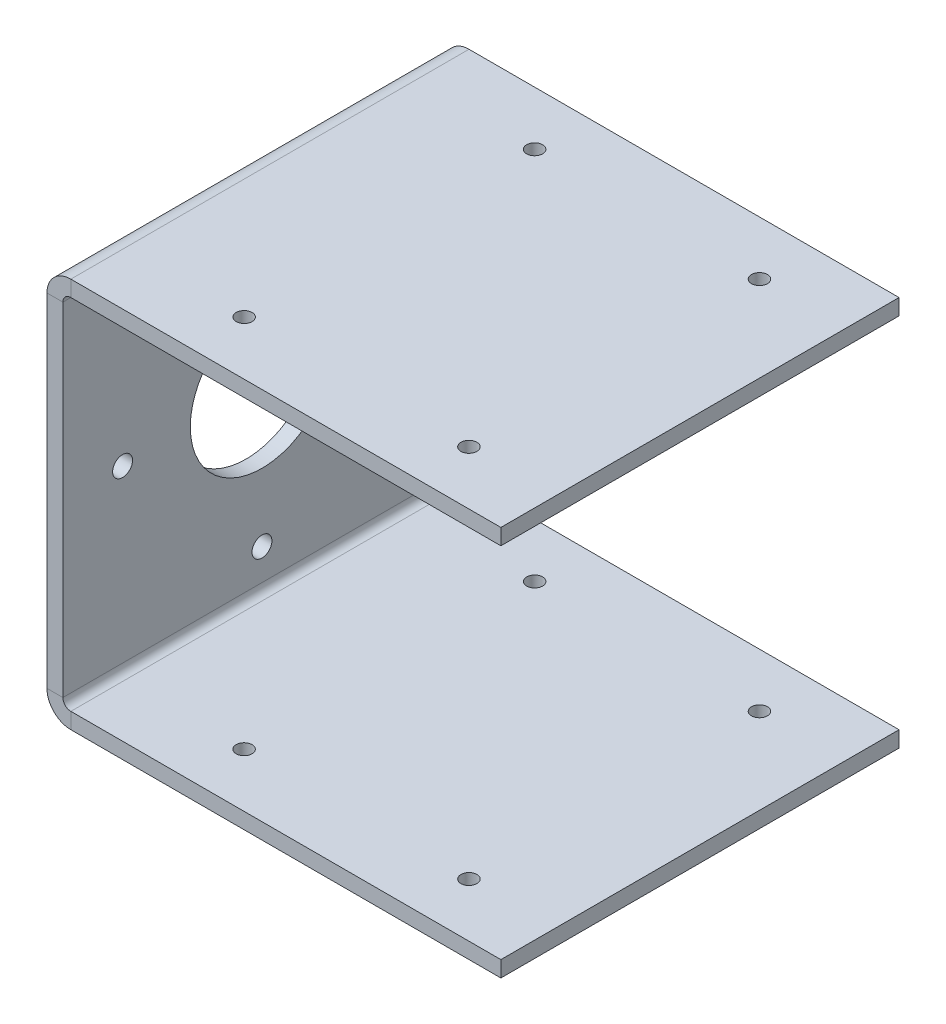
ISO-10303-21;
HEADER;
FILE_DESCRIPTION(('STEP AP214'),'2;1');
FILE_NAME('part.step','',(''),(''),'','','');
FILE_SCHEMA(('AUTOMOTIVE_DESIGN { 1 0 10303 214 1 1 1 1 }'));
ENDSEC;
DATA;
#1=APPLICATION_CONTEXT('core data for automotive mechanical design processes');
#2=APPLICATION_PROTOCOL_DEFINITION('international standard','automotive_design',2000,#1);
#3=PRODUCT_CONTEXT('',#1,'mechanical');
#4=PRODUCT('Part','Part','',(#3));
#5=PRODUCT_RELATED_PRODUCT_CATEGORY('part','',(#4));
#6=PRODUCT_DEFINITION_FORMATION('','',#4);
#7=PRODUCT_DEFINITION_CONTEXT('part definition',#1,'design');
#8=PRODUCT_DEFINITION('design','',#6,#7);
#9=PRODUCT_DEFINITION_SHAPE('','',#8);
#10=(LENGTH_UNIT() NAMED_UNIT(*) SI_UNIT(.MILLI.,.METRE.));
#11=(NAMED_UNIT(*) PLANE_ANGLE_UNIT() SI_UNIT($,.RADIAN.));
#12=(NAMED_UNIT(*) SI_UNIT($,.STERADIAN.) SOLID_ANGLE_UNIT());
#13=UNCERTAINTY_MEASURE_WITH_UNIT(LENGTH_MEASURE(1.E-05),#10,'distance_accuracy_value','');
#14=(GEOMETRIC_REPRESENTATION_CONTEXT(3) GLOBAL_UNCERTAINTY_ASSIGNED_CONTEXT((#13)) GLOBAL_UNIT_ASSIGNED_CONTEXT((#10,
#11,#12)) REPRESENTATION_CONTEXT('',''));
#15=CARTESIAN_POINT('',(0.,0.,0.));
#16=DIRECTION('',(0.,0.,1.));
#17=DIRECTION('',(1.,0.,0.));
#18=AXIS2_PLACEMENT_3D('',#15,#16,#17);
#19=CARTESIAN_POINT('',(0.,-1.99999999999996,100.));
#20=DIRECTION('',(0.,0.,1.));
#21=DIRECTION('',(1.,0.,0.));
#22=AXIS2_PLACEMENT_3D('',#19,#20,#21);
#23=PLANE('',#22);
#24=DIRECTION('',(-1.,0.,0.));
#25=VECTOR('',#24,1.);
#26=CARTESIAN_POINT('',(0.,-1.99999999999996,100.));
#27=LINE('',#26,#25);
#28=CARTESIAN_POINT('',(0.,-1.99999999999996,100.));
#29=VERTEX_POINT('',#28);
#30=CARTESIAN_POINT('',(-4.,-1.99999999999997,100.));
#31=VERTEX_POINT('',#30);
#32=EDGE_CURVE('E13',#29,#31,#27,.T.);
#33=ORIENTED_EDGE('',*,*,#32,.F.);
#34=CARTESIAN_POINT('',(2.,-1.99999999999996,100.));
#35=DIRECTION('',(0.,0.,-1.));
#36=DIRECTION('',(-1.,0.,0.));
#37=AXIS2_PLACEMENT_3D('',#34,#35,#36);
#38=CIRCLE('',#37,2.);
#39=CARTESIAN_POINT('',(2.,0.,100.));
#40=VERTEX_POINT('',#39);
#41=EDGE_CURVE('E261',#40,#29,#38,.F.);
#42=ORIENTED_EDGE('',*,*,#41,.F.);
#43=DIRECTION('',(0.,-1.,0.));
#44=VECTOR('',#43,1.);
#45=CARTESIAN_POINT('',(2.,4.00000000000006,100.));
#46=LINE('',#45,#44);
#47=CARTESIAN_POINT('',(2.,4.00000000000006,100.));
#48=VERTEX_POINT('',#47);
#49=EDGE_CURVE('E58',#48,#40,#46,.T.);
#50=ORIENTED_EDGE('',*,*,#49,.F.);
#51=CARTESIAN_POINT('',(2.,-1.99999999999996,100.));
#52=DIRECTION('',(0.,0.,1.));
#53=DIRECTION('',(1.,0.,0.));
#54=AXIS2_PLACEMENT_3D('',#51,#52,#53);
#55=CIRCLE('',#54,6.);
#56=EDGE_CURVE('E159',#48,#31,#55,.T.);
#57=ORIENTED_EDGE('',*,*,#56,.T.);
#58=EDGE_LOOP('',(#33,#42,#50,#57));
#59=FACE_BOUND('',#58,.T.);
#60=ADVANCED_FACE('F50',(#59),#23,.T.);
#61=CARTESIAN_POINT('',(2.,4.00000000000006,100.));
#62=DIRECTION('',(0.,0.,1.));
#63=DIRECTION('',(1.,0.,0.));
#64=AXIS2_PLACEMENT_3D('',#61,#62,#63);
#65=PLANE('',#64);
#66=DIRECTION('',(0.,-1.,0.));
#67=VECTOR('',#66,1.);
#68=CARTESIAN_POINT('',(0.,0.,100.));
#69=LINE('',#68,#67);
#70=CARTESIAN_POINT('',(0.,-88.,100.));
#71=VERTEX_POINT('',#70);
#72=EDGE_CURVE('E153',#29,#71,#69,.T.);
#73=ORIENTED_EDGE('',*,*,#72,.F.);
#74=ORIENTED_EDGE('',*,*,#32,.T.);
#75=DIRECTION('',(0.,-1.,0.));
#76=VECTOR('',#75,1.);
#77=CARTESIAN_POINT('',(-4.,0.,100.));
#78=LINE('',#77,#76);
#79=CARTESIAN_POINT('',(-4.,-87.9999999999999,100.));
#80=VERTEX_POINT('',#79);
#81=EDGE_CURVE('E150',#31,#80,#78,.T.);
#82=ORIENTED_EDGE('',*,*,#81,.T.);
#83=DIRECTION('',(1.,0.,0.));
#84=VECTOR('',#83,1.);
#85=CARTESIAN_POINT('',(-4.,-87.9999999999999,100.));
#86=LINE('',#85,#84);
#87=EDGE_CURVE('E242',#80,#71,#86,.T.);
#88=ORIENTED_EDGE('',*,*,#87,.T.);
#89=EDGE_LOOP('',(#73,#74,#82,#88));
#90=FACE_BOUND('',#89,.T.);
#91=ADVANCED_FACE('F148',(#90),#65,.T.);
#92=CARTESIAN_POINT('',(2.,0.,0.));
#93=DIRECTION('',(0.,0.,-1.));
#94=DIRECTION('',(-1.,0.,0.));
#95=AXIS2_PLACEMENT_3D('',#92,#93,#94);
#96=PLANE('',#95);
#97=DIRECTION('',(0.,1.,0.));
#98=VECTOR('',#97,1.);
#99=CARTESIAN_POINT('',(2.,0.,0.));
#100=LINE('',#99,#98);
#101=CARTESIAN_POINT('',(2.,0.,0.));
#102=VERTEX_POINT('',#101);
#103=CARTESIAN_POINT('',(2.,4.00000000000003,0.));
#104=VERTEX_POINT('',#103);
#105=EDGE_CURVE('E247',#102,#104,#100,.T.);
#106=ORIENTED_EDGE('',*,*,#105,.F.);
#107=CARTESIAN_POINT('',(2.,-2.,0.));
#108=DIRECTION('',(0.,0.,-1.));
#109=DIRECTION('',(-1.,0.,0.));
#110=AXIS2_PLACEMENT_3D('',#107,#108,#109);
#111=CIRCLE('',#110,2.);
#112=CARTESIAN_POINT('',(0.,-2.,0.));
#113=VERTEX_POINT('',#112);
#114=EDGE_CURVE('E199',#102,#113,#111,.F.);
#115=ORIENTED_EDGE('',*,*,#114,.T.);
#116=DIRECTION('',(1.,0.,0.));
#117=VECTOR('',#116,1.);
#118=CARTESIAN_POINT('',(-4.,-2.00000000000002,0.));
#119=LINE('',#118,#117);
#120=CARTESIAN_POINT('',(-4.,-2.00000000000002,0.));
#121=VERTEX_POINT('',#120);
#122=EDGE_CURVE('E245',#121,#113,#119,.T.);
#123=ORIENTED_EDGE('',*,*,#122,.F.);
#124=CARTESIAN_POINT('',(2.,-2.,0.));
#125=DIRECTION('',(0.,0.,1.));
#126=DIRECTION('',(1.,0.,0.));
#127=AXIS2_PLACEMENT_3D('',#124,#125,#126);
#128=CIRCLE('',#127,6.);
#129=EDGE_CURVE('E171',#104,#121,#128,.T.);
#130=ORIENTED_EDGE('',*,*,#129,.F.);
#131=EDGE_LOOP('',(#106,#115,#123,#130));
#132=FACE_BOUND('',#131,.T.);
#133=ADVANCED_FACE('F393',(#132),#96,.T.);
#134=CARTESIAN_POINT('',(-4.,-2.00000000000002,0.));
#135=DIRECTION('',(0.,0.,-1.));
#136=DIRECTION('',(-1.,0.,0.));
#137=AXIS2_PLACEMENT_3D('',#134,#135,#136);
#138=PLANE('',#137);
#139=DIRECTION('',(-1.,0.,0.));
#140=VECTOR('',#139,1.);
#141=CARTESIAN_POINT('',(110.,0.,0.));
#142=LINE('',#141,#140);
#143=CARTESIAN_POINT('',(110.,0.,0.));
#144=VERTEX_POINT('',#143);
#145=EDGE_CURVE('E202',#144,#102,#142,.T.);
#146=ORIENTED_EDGE('',*,*,#145,.T.);
#147=ORIENTED_EDGE('',*,*,#105,.T.);
#148=DIRECTION('',(-1.,0.,0.));
#149=VECTOR('',#148,1.);
#150=CARTESIAN_POINT('',(110.,4.00000000000002,0.));
#151=LINE('',#150,#149);
#152=CARTESIAN_POINT('',(110.,4.00000000000002,0.));
#153=VERTEX_POINT('',#152);
#154=EDGE_CURVE('E208',#153,#104,#151,.T.);
#155=ORIENTED_EDGE('',*,*,#154,.F.);
#156=DIRECTION('',(0.,-1.,0.));
#157=VECTOR('',#156,1.);
#158=CARTESIAN_POINT('',(110.,4.00000000000002,0.));
#159=LINE('',#158,#157);
#160=EDGE_CURVE('E205',#153,#144,#159,.T.);
#161=ORIENTED_EDGE('',*,*,#160,.T.);
#162=EDGE_LOOP('',(#146,#147,#155,#161));
#163=FACE_BOUND('',#162,.T.);
#164=ADVANCED_FACE('F397',(#163),#138,.T.);
#165=CARTESIAN_POINT('',(2.,-90.,100.));
#166=DIRECTION('',(0.,0.,1.));
#167=DIRECTION('',(1.,0.,0.));
#168=AXIS2_PLACEMENT_3D('',#165,#166,#167);
#169=PLANE('',#168);
#170=DIRECTION('',(0.,-1.,0.));
#171=VECTOR('',#170,1.);
#172=CARTESIAN_POINT('',(2.,-90.,100.));
#173=LINE('',#172,#171);
#174=CARTESIAN_POINT('',(2.,-90.,100.));
#175=VERTEX_POINT('',#174);
#176=CARTESIAN_POINT('',(2.,-94.0000000000001,100.));
#177=VERTEX_POINT('',#176);
#178=EDGE_CURVE('E66',#175,#177,#173,.T.);
#179=ORIENTED_EDGE('',*,*,#178,.F.);
#180=CARTESIAN_POINT('',(2.,-88.,100.));
#181=DIRECTION('',(0.,0.,-1.));
#182=DIRECTION('',(-1.,0.,0.));
#183=AXIS2_PLACEMENT_3D('',#180,#181,#182);
#184=CIRCLE('',#183,2.);
#185=EDGE_CURVE('E271',#71,#175,#184,.F.);
#186=ORIENTED_EDGE('',*,*,#185,.F.);
#187=ORIENTED_EDGE('',*,*,#87,.F.);
#188=CARTESIAN_POINT('',(2.,-88.,100.));
#189=DIRECTION('',(0.,0.,1.));
#190=DIRECTION('',(1.,0.,0.));
#191=AXIS2_PLACEMENT_3D('',#188,#189,#190);
#192=CIRCLE('',#191,6.);
#193=EDGE_CURVE('E179',#80,#177,#192,.T.);
#194=ORIENTED_EDGE('',*,*,#193,.T.);
#195=EDGE_LOOP('',(#179,#186,#187,#194));
#196=FACE_BOUND('',#195,.T.);
#197=ADVANCED_FACE('F403',(#196),#169,.T.);
#198=CARTESIAN_POINT('',(-4.,-87.9999999999999,100.));
#199=DIRECTION('',(0.,0.,1.));
#200=DIRECTION('',(1.,0.,0.));
#201=AXIS2_PLACEMENT_3D('',#198,#199,#200);
#202=PLANE('',#201);
#203=DIRECTION('',(1.,0.,0.));
#204=VECTOR('',#203,1.);
#205=CARTESIAN_POINT('',(0.,-90.,100.));
#206=LINE('',#205,#204);
#207=CARTESIAN_POINT('',(110.,-90.,100.));
#208=VERTEX_POINT('',#207);
#209=EDGE_CURVE('E274',#175,#208,#206,.T.);
#210=ORIENTED_EDGE('',*,*,#209,.F.);
#211=ORIENTED_EDGE('',*,*,#178,.T.);
#212=DIRECTION('',(1.,0.,0.));
#213=VECTOR('',#212,1.);
#214=CARTESIAN_POINT('',(0.,-94.0000000000001,100.));
#215=LINE('',#214,#213);
#216=CARTESIAN_POINT('',(110.,-94.0000000000001,100.));
#217=VERTEX_POINT('',#216);
#218=EDGE_CURVE('E120',#177,#217,#215,.T.);
#219=ORIENTED_EDGE('',*,*,#218,.T.);
#220=DIRECTION('',(0.,-1.,0.));
#221=VECTOR('',#220,1.);
#222=CARTESIAN_POINT('',(110.,-90.,100.));
#223=LINE('',#222,#221);
#224=EDGE_CURVE('E277',#208,#217,#223,.T.);
#225=ORIENTED_EDGE('',*,*,#224,.F.);
#226=EDGE_LOOP('',(#210,#211,#219,#225));
#227=FACE_BOUND('',#226,.T.);
#228=ADVANCED_FACE('F407',(#227),#202,.T.);
#229=CARTESIAN_POINT('',(0.,-88.,0.));
#230=DIRECTION('',(0.,0.,-1.));
#231=DIRECTION('',(-1.,0.,0.));
#232=AXIS2_PLACEMENT_3D('',#229,#230,#231);
#233=PLANE('',#232);
#234=DIRECTION('',(-1.,0.,0.));
#235=VECTOR('',#234,1.);
#236=CARTESIAN_POINT('',(0.,-88.,0.));
#237=LINE('',#236,#235);
#238=CARTESIAN_POINT('',(0.,-88.,0.));
#239=VERTEX_POINT('',#238);
#240=CARTESIAN_POINT('',(-3.99999999999995,-87.9999999999999,0.));
#241=VERTEX_POINT('',#240);
#242=EDGE_CURVE('E107',#239,#241,#237,.T.);
#243=ORIENTED_EDGE('',*,*,#242,.F.);
#244=CARTESIAN_POINT('',(2.00000000000006,-88.,0.));
#245=DIRECTION('',(0.,0.,-1.));
#246=DIRECTION('',(-1.,0.,0.));
#247=AXIS2_PLACEMENT_3D('',#244,#245,#246);
#248=CIRCLE('',#247,2.);
#249=CARTESIAN_POINT('',(2.00000000000006,-90.0000000000001,0.));
#250=VERTEX_POINT('',#249);
#251=EDGE_CURVE('E195',#239,#250,#248,.F.);
#252=ORIENTED_EDGE('',*,*,#251,.T.);
#253=DIRECTION('',(0.,1.,0.));
#254=VECTOR('',#253,1.);
#255=CARTESIAN_POINT('',(2.00000000000006,-94.0000000000001,0.));
#256=LINE('',#255,#254);
#257=CARTESIAN_POINT('',(2.00000000000006,-94.0000000000001,0.));
#258=VERTEX_POINT('',#257);
#259=EDGE_CURVE('E114',#258,#250,#256,.T.);
#260=ORIENTED_EDGE('',*,*,#259,.F.);
#261=CARTESIAN_POINT('',(2.00000000000006,-88.,0.));
#262=DIRECTION('',(0.,0.,1.));
#263=DIRECTION('',(1.,0.,0.));
#264=AXIS2_PLACEMENT_3D('',#261,#262,#263);
#265=CIRCLE('',#264,6.);
#266=EDGE_CURVE('E214',#241,#258,#265,.T.);
#267=ORIENTED_EDGE('',*,*,#266,.F.);
#268=EDGE_LOOP('',(#243,#252,#260,#267));
#269=FACE_BOUND('',#268,.T.);
#270=ADVANCED_FACE('F411',(#269),#233,.T.);
#271=CARTESIAN_POINT('',(2.00000000000006,-94.0000000000001,0.));
#272=DIRECTION('',(0.,0.,-1.));
#273=DIRECTION('',(-1.,0.,0.));
#274=AXIS2_PLACEMENT_3D('',#271,#272,#273);
#275=PLANE('',#274);
#276=DIRECTION('',(0.,-1.,0.));
#277=VECTOR('',#276,1.);
#278=CARTESIAN_POINT('',(0.,0.,0.));
#279=LINE('',#278,#277);
#280=EDGE_CURVE('E197',#113,#239,#279,.T.);
#281=ORIENTED_EDGE('',*,*,#280,.T.);
#282=ORIENTED_EDGE('',*,*,#242,.T.);
#283=DIRECTION('',(0.,-1.,0.));
#284=VECTOR('',#283,1.);
#285=CARTESIAN_POINT('',(-4.,0.,0.));
#286=LINE('',#285,#284);
#287=EDGE_CURVE('E212',#121,#241,#286,.T.);
#288=ORIENTED_EDGE('',*,*,#287,.F.);
#289=ORIENTED_EDGE('',*,*,#122,.T.);
#290=EDGE_LOOP('',(#281,#282,#288,#289));
#291=FACE_BOUND('',#290,.T.);
#292=ADVANCED_FACE('F414',(#291),#275,.T.);
#293=CARTESIAN_POINT('',(0.,-94.0000000000001,100.));
#294=DIRECTION('',(0.,1.,0.));
#295=DIRECTION('',(0.,0.,1.));
#296=AXIS2_PLACEMENT_3D('',#293,#294,#295);
#297=PLANE('',#296);
#298=CARTESIAN_POINT('',(32.,-94.0000000000001,86.4831094633034));
#299=DIRECTION('',(0.,-1.,0.));
#300=DIRECTION('',(0.,0.,-1.));
#301=AXIS2_PLACEMENT_3D('',#298,#299,#300);
#302=CIRCLE('',#301,1.99999999999999);
#303=CARTESIAN_POINT('',(32.,-94.0000000000001,84.4831094633034));
#304=VERTEX_POINT('',#303);
#305=EDGE_CURVE('E329',#304,#304,#302,.T.);
#306=ORIENTED_EDGE('',*,*,#305,.F.);
#307=EDGE_LOOP('',(#306));
#308=FACE_BOUND('',#307,.T.);
#309=CARTESIAN_POINT('',(32.,-94.0000000000001,13.5168905366967));
#310=DIRECTION('',(0.,-1.,0.));
#311=DIRECTION('',(0.,0.,-1.));
#312=AXIS2_PLACEMENT_3D('',#309,#310,#311);
#313=CIRCLE('',#312,1.99999999999999);
#314=CARTESIAN_POINT('',(32.,-94.0000000000001,11.5168905366968));
#315=VERTEX_POINT('',#314);
#316=EDGE_CURVE('E317',#315,#315,#313,.T.);
#317=ORIENTED_EDGE('',*,*,#316,.F.);
#318=EDGE_LOOP('',(#317));
#319=FACE_BOUND('',#318,.T.);
#320=CARTESIAN_POINT('',(88.4631060556119,-94.0000000000001,86.4831094633034));
#321=DIRECTION('',(0.,-1.,0.));
#322=DIRECTION('',(0.,0.,-1.));
#323=AXIS2_PLACEMENT_3D('',#320,#321,#322);
#324=CIRCLE('',#323,1.99999999999999);
#325=CARTESIAN_POINT('',(88.4631060556119,-94.0000000000001,84.4831094633034));
#326=VERTEX_POINT('',#325);
#327=EDGE_CURVE('E305',#326,#326,#324,.T.);
#328=ORIENTED_EDGE('',*,*,#327,.F.);
#329=EDGE_LOOP('',(#328));
#330=FACE_BOUND('',#329,.T.);
#331=CARTESIAN_POINT('',(88.463106055612,-94.0000000000001,13.5168905366967));
#332=DIRECTION('',(0.,-1.,0.));
#333=DIRECTION('',(0.,0.,-1.));
#334=AXIS2_PLACEMENT_3D('',#331,#332,#333);
#335=CIRCLE('',#334,1.99999999999999);
#336=CARTESIAN_POINT('',(88.463106055612,-94.0000000000001,11.5168905366968));
#337=VERTEX_POINT('',#336);
#338=EDGE_CURVE('E293',#337,#337,#335,.T.);
#339=ORIENTED_EDGE('',*,*,#338,.F.);
#340=EDGE_LOOP('',(#339));
#341=FACE_BOUND('',#340,.T.);
#342=DIRECTION('',(1.,0.,0.));
#343=VECTOR('',#342,1.);
#344=CARTESIAN_POINT('',(0.,-94.0000000000001,0.));
#345=LINE('',#344,#343);
#346=CARTESIAN_POINT('',(110.,-94.0000000000001,0.));
#347=VERTEX_POINT('',#346);
#348=EDGE_CURVE('E185',#258,#347,#345,.T.);
#349=ORIENTED_EDGE('',*,*,#348,.T.);
#350=DIRECTION('',(0.,0.,-1.));
#351=VECTOR('',#350,1.);
#352=CARTESIAN_POINT('',(110.,-94.0000000000001,100.));
#353=LINE('',#352,#351);
#354=EDGE_CURVE('E238',#217,#347,#353,.T.);
#355=ORIENTED_EDGE('',*,*,#354,.F.);
#356=ORIENTED_EDGE('',*,*,#218,.F.);
#357=DIRECTION('',(0.,0.,-1.));
#358=VECTOR('',#357,1.);
#359=CARTESIAN_POINT('',(2.,-94.0000000000001,100.));
#360=LINE('',#359,#358);
#361=EDGE_CURVE('E181',#177,#258,#360,.T.);
#362=ORIENTED_EDGE('',*,*,#361,.T.);
#363=EDGE_LOOP('',(#349,#355,#356,#362));
#364=FACE_BOUND('',#363,.T.);
#365=ADVANCED_FACE('F417',(#308,#319,#330,#341,#364),#297,.F.);
#366=CARTESIAN_POINT('',(110.,-90.,100.));
#367=DIRECTION('',(1.,0.,0.));
#368=DIRECTION('',(0.,0.,-1.));
#369=AXIS2_PLACEMENT_3D('',#366,#367,#368);
#370=PLANE('',#369);
#371=DIRECTION('',(0.,-1.,0.));
#372=VECTOR('',#371,1.);
#373=CARTESIAN_POINT('',(110.,-90.0000000000001,0.));
#374=LINE('',#373,#372);
#375=CARTESIAN_POINT('',(110.,-90.0000000000001,0.));
#376=VERTEX_POINT('',#375);
#377=EDGE_CURVE('E188',#376,#347,#374,.T.);
#378=ORIENTED_EDGE('',*,*,#377,.F.);
#379=DIRECTION('',(0.,0.,-1.));
#380=VECTOR('',#379,1.);
#381=CARTESIAN_POINT('',(110.,-90.,100.));
#382=LINE('',#381,#380);
#383=EDGE_CURVE('E236',#208,#376,#382,.T.);
#384=ORIENTED_EDGE('',*,*,#383,.F.);
#385=ORIENTED_EDGE('',*,*,#224,.T.);
#386=ORIENTED_EDGE('',*,*,#354,.T.);
#387=EDGE_LOOP('',(#378,#384,#385,#386));
#388=FACE_BOUND('',#387,.T.);
#389=ADVANCED_FACE('F420',(#388),#370,.T.);
#390=CARTESIAN_POINT('',(0.,-90.,100.));
#391=DIRECTION('',(0.,1.,0.));
#392=DIRECTION('',(0.,0.,1.));
#393=AXIS2_PLACEMENT_3D('',#390,#391,#392);
#394=PLANE('',#393);
#395=CARTESIAN_POINT('',(32.,-90.,86.4831094633034));
#396=DIRECTION('',(0.,1.,0.));
#397=DIRECTION('',(0.,0.,1.));
#398=AXIS2_PLACEMENT_3D('',#395,#396,#397);
#399=CIRCLE('',#398,1.99999999999998);
#400=CARTESIAN_POINT('',(32.,-90.,88.4831094633034));
#401=VERTEX_POINT('',#400);
#402=EDGE_CURVE('E320',#401,#401,#399,.T.);
#403=ORIENTED_EDGE('',*,*,#402,.F.);
#404=EDGE_LOOP('',(#403));
#405=FACE_BOUND('',#404,.T.);
#406=CARTESIAN_POINT('',(32.,-90.0000000000001,13.5168905366967));
#407=DIRECTION('',(0.,1.,0.));
#408=DIRECTION('',(0.,0.,1.));
#409=AXIS2_PLACEMENT_3D('',#406,#407,#408);
#410=CIRCLE('',#409,1.99999999999998);
#411=CARTESIAN_POINT('',(32.,-90.0000000000001,15.5168905366967));
#412=VERTEX_POINT('',#411);
#413=EDGE_CURVE('E308',#412,#412,#410,.T.);
#414=ORIENTED_EDGE('',*,*,#413,.F.);
#415=EDGE_LOOP('',(#414));
#416=FACE_BOUND('',#415,.T.);
#417=CARTESIAN_POINT('',(88.4631060556119,-90.,86.4831094633034));
#418=DIRECTION('',(0.,1.,0.));
#419=DIRECTION('',(0.,0.,1.));
#420=AXIS2_PLACEMENT_3D('',#417,#418,#419);
#421=CIRCLE('',#420,1.99999999999998);
#422=CARTESIAN_POINT('',(88.4631060556119,-90.,88.4831094633034));
#423=VERTEX_POINT('',#422);
#424=EDGE_CURVE('E301',#423,#423,#421,.T.);
#425=ORIENTED_EDGE('',*,*,#424,.F.);
#426=EDGE_LOOP('',(#425));
#427=FACE_BOUND('',#426,.T.);
#428=CARTESIAN_POINT('',(88.463106055612,-90.,13.5168905366967));
#429=DIRECTION('',(0.,1.,0.));
#430=DIRECTION('',(0.,0.,1.));
#431=AXIS2_PLACEMENT_3D('',#428,#429,#430);
#432=CIRCLE('',#431,1.99999999999998);
#433=CARTESIAN_POINT('',(88.463106055612,-90.,15.5168905366967));
#434=VERTEX_POINT('',#433);
#435=EDGE_CURVE('E289',#434,#434,#432,.T.);
#436=ORIENTED_EDGE('',*,*,#435,.F.);
#437=EDGE_LOOP('',(#436));
#438=FACE_BOUND('',#437,.T.);
#439=DIRECTION('',(1.,0.,0.));
#440=VECTOR('',#439,1.);
#441=CARTESIAN_POINT('',(0.,-90.0000000000001,0.));
#442=LINE('',#441,#440);
#443=EDGE_CURVE('E192',#250,#376,#442,.T.);
#444=ORIENTED_EDGE('',*,*,#443,.F.);
#445=DIRECTION('',(0.,0.,-1.));
#446=VECTOR('',#445,1.);
#447=CARTESIAN_POINT('',(2.,-90.,100.));
#448=LINE('',#447,#446);
#449=EDGE_CURVE('E233',#175,#250,#448,.T.);
#450=ORIENTED_EDGE('',*,*,#449,.F.);
#451=ORIENTED_EDGE('',*,*,#209,.T.);
#452=ORIENTED_EDGE('',*,*,#383,.T.);
#453=EDGE_LOOP('',(#444,#450,#451,#452));
#454=FACE_BOUND('',#453,.T.);
#455=ADVANCED_FACE('F424',(#405,#416,#427,#438,#454),#394,.T.);
#456=CARTESIAN_POINT('',(2.,-88.,100.));
#457=DIRECTION('',(0.,0.,-1.));
#458=DIRECTION('',(-1.,0.,0.));
#459=AXIS2_PLACEMENT_3D('',#456,#457,#458);
#460=CYLINDRICAL_SURFACE('',#459,2.);
#461=ORIENTED_EDGE('',*,*,#251,.F.);
#462=DIRECTION('',(0.,0.,-1.));
#463=VECTOR('',#462,1.);
#464=CARTESIAN_POINT('',(0.,-88.,100.));
#465=LINE('',#464,#463);
#466=EDGE_CURVE('E230',#71,#239,#465,.T.);
#467=ORIENTED_EDGE('',*,*,#466,.F.);
#468=ORIENTED_EDGE('',*,*,#185,.T.);
#469=ORIENTED_EDGE('',*,*,#449,.T.);
#470=EDGE_LOOP('',(#461,#467,#468,#469));
#471=FACE_BOUND('',#470,.T.);
#472=ADVANCED_FACE('F428',(#471),#460,.F.);
#473=CARTESIAN_POINT('',(0.,0.,100.));
#474=DIRECTION('',(1.,0.,0.));
#475=DIRECTION('',(0.,1.,0.));
#476=AXIS2_PLACEMENT_3D('',#473,#474,#475);
#477=PLANE('',#476);
#478=CARTESIAN_POINT('',(0.,-10.1536417771119,49.999999999997));
#479=DIRECTION('',(1.,0.,0.));
#480=DIRECTION('',(0.,1.,0.));
#481=AXIS2_PLACEMENT_3D('',#478,#479,#480);
#482=CIRCLE('',#481,2.49999999999998);
#483=CARTESIAN_POINT('',(0.,-7.65364177711191,49.999999999997));
#484=VERTEX_POINT('',#483);
#485=EDGE_CURVE('E352',#484,#484,#482,.T.);
#486=ORIENTED_EDGE('',*,*,#485,.F.);
#487=EDGE_LOOP('',(#486));
#488=FACE_BOUND('',#487,.T.);
#489=CARTESIAN_POINT('',(0.,-45.1536417771089,84.9999999999999));
#490=DIRECTION('',(1.,0.,0.));
#491=DIRECTION('',(0.,1.,0.));
#492=AXIS2_PLACEMENT_3D('',#489,#490,#491);
#493=CIRCLE('',#492,2.49999999999998);
#494=CARTESIAN_POINT('',(0.,-42.653641777109,84.9999999999999));
#495=VERTEX_POINT('',#494);
#496=EDGE_CURVE('E346',#495,#495,#493,.T.);
#497=ORIENTED_EDGE('',*,*,#496,.F.);
#498=EDGE_LOOP('',(#497));
#499=FACE_BOUND('',#498,.T.);
#500=CARTESIAN_POINT('',(0.,-80.153641777112,50.0000000000029));
#501=DIRECTION('',(1.,0.,0.));
#502=DIRECTION('',(0.,1.,0.));
#503=AXIS2_PLACEMENT_3D('',#500,#501,#502);
#504=CIRCLE('',#503,2.49999999999998);
#505=CARTESIAN_POINT('',(0.,-77.653641777112,50.0000000000029));
#506=VERTEX_POINT('',#505);
#507=EDGE_CURVE('E340',#506,#506,#504,.T.);
#508=ORIENTED_EDGE('',*,*,#507,.F.);
#509=EDGE_LOOP('',(#508));
#510=FACE_BOUND('',#509,.T.);
#511=CARTESIAN_POINT('',(0.,-45.1536417771149,14.9999999999999));
#512=DIRECTION('',(1.,0.,0.));
#513=DIRECTION('',(0.,1.,0.));
#514=AXIS2_PLACEMENT_3D('',#511,#512,#513);
#515=CIRCLE('',#514,2.49999999999998);
#516=CARTESIAN_POINT('',(0.,-42.6536417771149,14.9999999999999));
#517=VERTEX_POINT('',#516);
#518=EDGE_CURVE('E332',#517,#517,#515,.T.);
#519=ORIENTED_EDGE('',*,*,#518,.F.);
#520=EDGE_LOOP('',(#519));
#521=FACE_BOUND('',#520,.T.);
#522=CARTESIAN_POINT('',(0.,-45.1536417771149,49.9999999999999));
#523=DIRECTION('',(1.,0.,0.));
#524=DIRECTION('',(0.,1.,0.));
#525=AXIS2_PLACEMENT_3D('',#522,#523,#524);
#526=CIRCLE('',#525,18.);
#527=CARTESIAN_POINT('',(0.,-27.1536417771149,49.9999999999999));
#528=VERTEX_POINT('',#527);
#529=EDGE_CURVE('E189',#528,#528,#526,.T.);
#530=ORIENTED_EDGE('',*,*,#529,.F.);
#531=EDGE_LOOP('',(#530));
#532=FACE_BOUND('',#531,.T.);
#533=ORIENTED_EDGE('',*,*,#280,.F.);
#534=DIRECTION('',(0.,0.,-1.));
#535=VECTOR('',#534,1.);
#536=CARTESIAN_POINT('',(0.,-1.99999999999996,100.));
#537=LINE('',#536,#535);
#538=EDGE_CURVE('E227',#29,#113,#537,.T.);
#539=ORIENTED_EDGE('',*,*,#538,.F.);
#540=ORIENTED_EDGE('',*,*,#72,.T.);
#541=ORIENTED_EDGE('',*,*,#466,.T.);
#542=EDGE_LOOP('',(#533,#539,#540,#541));
#543=FACE_BOUND('',#542,.T.);
#544=ADVANCED_FACE('F432',(#488,#499,#510,#521,#532,#543),#477,.T.);
#545=CARTESIAN_POINT('',(2.,-1.99999999999996,100.));
#546=DIRECTION('',(0.,0.,-1.));
#547=DIRECTION('',(-1.,0.,0.));
#548=AXIS2_PLACEMENT_3D('',#545,#546,#547);
#549=CYLINDRICAL_SURFACE('',#548,2.);
#550=ORIENTED_EDGE('',*,*,#114,.F.);
#551=DIRECTION('',(0.,0.,-1.));
#552=VECTOR('',#551,1.);
#553=CARTESIAN_POINT('',(2.,0.,100.));
#554=LINE('',#553,#552);
#555=EDGE_CURVE('E224',#40,#102,#554,.T.);
#556=ORIENTED_EDGE('',*,*,#555,.F.);
#557=ORIENTED_EDGE('',*,*,#41,.T.);
#558=ORIENTED_EDGE('',*,*,#538,.T.);
#559=EDGE_LOOP('',(#550,#556,#557,#558));
#560=FACE_BOUND('',#559,.T.);
#561=ADVANCED_FACE('F260',(#560),#549,.F.);
#562=CARTESIAN_POINT('',(110.,0.,100.));
#563=DIRECTION('',(0.,-1.,0.));
#564=DIRECTION('',(1.,0.,0.));
#565=AXIS2_PLACEMENT_3D('',#562,#563,#564);
#566=PLANE('',#565);
#567=CARTESIAN_POINT('',(32.,0.,86.4831094633034));
#568=DIRECTION('',(0.,-1.,0.));
#569=DIRECTION('',(1.,0.,0.));
#570=AXIS2_PLACEMENT_3D('',#567,#568,#569);
#571=CIRCLE('',#570,1.99999999999998);
#572=CARTESIAN_POINT('',(34.,0.,86.4831094633034));
#573=VERTEX_POINT('',#572);
#574=EDGE_CURVE('E325',#573,#573,#571,.T.);
#575=ORIENTED_EDGE('',*,*,#574,.F.);
#576=EDGE_LOOP('',(#575));
#577=FACE_BOUND('',#576,.T.);
#578=CARTESIAN_POINT('',(32.,0.,13.5168905366968));
#579=DIRECTION('',(0.,-1.,0.));
#580=DIRECTION('',(1.,0.,0.));
#581=AXIS2_PLACEMENT_3D('',#578,#579,#580);
#582=CIRCLE('',#581,1.99999999999998);
#583=CARTESIAN_POINT('',(34.,0.,13.5168905366968));
#584=VERTEX_POINT('',#583);
#585=EDGE_CURVE('E313',#584,#584,#582,.T.);
#586=ORIENTED_EDGE('',*,*,#585,.F.);
#587=EDGE_LOOP('',(#586));
#588=FACE_BOUND('',#587,.T.);
#589=CARTESIAN_POINT('',(88.4631060556119,0.,86.4831094633034));
#590=DIRECTION('',(0.,-1.,0.));
#591=DIRECTION('',(1.,0.,0.));
#592=AXIS2_PLACEMENT_3D('',#589,#590,#591);
#593=CIRCLE('',#592,1.99999999999998);
#594=CARTESIAN_POINT('',(90.4631060556119,0.,86.4831094633034));
#595=VERTEX_POINT('',#594);
#596=EDGE_CURVE('E296',#595,#595,#593,.T.);
#597=ORIENTED_EDGE('',*,*,#596,.F.);
#598=EDGE_LOOP('',(#597));
#599=FACE_BOUND('',#598,.T.);
#600=CARTESIAN_POINT('',(88.463106055612,0.,13.5168905366968));
#601=DIRECTION('',(0.,-1.,0.));
#602=DIRECTION('',(1.,0.,0.));
#603=AXIS2_PLACEMENT_3D('',#600,#601,#602);
#604=CIRCLE('',#603,1.99999999999998);
#605=CARTESIAN_POINT('',(90.4631060556119,0.,13.5168905366968));
#606=VERTEX_POINT('',#605);
#607=EDGE_CURVE('E286',#606,#606,#604,.T.);
#608=ORIENTED_EDGE('',*,*,#607,.F.);
#609=EDGE_LOOP('',(#608));
#610=FACE_BOUND('',#609,.T.);
#611=ORIENTED_EDGE('',*,*,#145,.F.);
#612=DIRECTION('',(0.,0.,-1.));
#613=VECTOR('',#612,1.);
#614=CARTESIAN_POINT('',(110.,0.,100.));
#615=LINE('',#614,#613);
#616=CARTESIAN_POINT('',(110.,0.,100.));
#617=VERTEX_POINT('',#616);
#618=EDGE_CURVE('E222',#617,#144,#615,.T.);
#619=ORIENTED_EDGE('',*,*,#618,.F.);
#620=DIRECTION('',(-1.,0.,0.));
#621=VECTOR('',#620,1.);
#622=CARTESIAN_POINT('',(110.,0.,100.));
#623=LINE('',#622,#621);
#624=EDGE_CURVE('E254',#617,#40,#623,.T.);
#625=ORIENTED_EDGE('',*,*,#624,.T.);
#626=ORIENTED_EDGE('',*,*,#555,.T.);
#627=EDGE_LOOP('',(#611,#619,#625,#626));
#628=FACE_BOUND('',#627,.T.);
#629=ADVANCED_FACE('F265',(#577,#588,#599,#610,#628),#566,.T.);
#630=CARTESIAN_POINT('',(110.,4.00000000000005,100.));
#631=DIRECTION('',(1.,0.,0.));
#632=DIRECTION('',(0.,0.,-1.));
#633=AXIS2_PLACEMENT_3D('',#630,#631,#632);
#634=PLANE('',#633);
#635=ORIENTED_EDGE('',*,*,#160,.F.);
#636=DIRECTION('',(0.,0.,-1.));
#637=VECTOR('',#636,1.);
#638=CARTESIAN_POINT('',(110.,4.00000000000005,100.));
#639=LINE('',#638,#637);
#640=CARTESIAN_POINT('',(110.,4.00000000000005,100.));
#641=VERTEX_POINT('',#640);
#642=EDGE_CURVE('E220',#641,#153,#639,.T.);
#643=ORIENTED_EDGE('',*,*,#642,.F.);
#644=DIRECTION('',(0.,-1.,0.));
#645=VECTOR('',#644,1.);
#646=CARTESIAN_POINT('',(110.,4.00000000000005,100.));
#647=LINE('',#646,#645);
#648=EDGE_CURVE('E266',#641,#617,#647,.T.);
#649=ORIENTED_EDGE('',*,*,#648,.T.);
#650=ORIENTED_EDGE('',*,*,#618,.T.);
#651=EDGE_LOOP('',(#635,#643,#649,#650));
#652=FACE_BOUND('',#651,.T.);
#653=ADVANCED_FACE('F441',(#652),#634,.T.);
#654=CARTESIAN_POINT('',(110.,4.00000000000005,100.));
#655=DIRECTION('',(0.,-1.,0.));
#656=DIRECTION('',(1.,0.,0.));
#657=AXIS2_PLACEMENT_3D('',#654,#655,#656);
#658=PLANE('',#657);
#659=CARTESIAN_POINT('',(32.,4.00000000000005,86.4831094633034));
#660=DIRECTION('',(0.,-1.,0.));
#661=DIRECTION('',(1.,0.,0.));
#662=AXIS2_PLACEMENT_3D('',#659,#660,#661);
#663=CIRCLE('',#662,1.99999999999998);
#664=CARTESIAN_POINT('',(34.,4.00000000000005,86.4831094633034));
#665=VERTEX_POINT('',#664);
#666=EDGE_CURVE('E328',#665,#665,#663,.F.);
#667=ORIENTED_EDGE('',*,*,#666,.F.);
#668=EDGE_LOOP('',(#667));
#669=FACE_BOUND('',#668,.T.);
#670=CARTESIAN_POINT('',(32.,4.00000000000003,13.5168905366968));
#671=DIRECTION('',(0.,-1.,0.));
#672=DIRECTION('',(1.,0.,0.));
#673=AXIS2_PLACEMENT_3D('',#670,#671,#672);
#674=CIRCLE('',#673,1.99999999999998);
#675=CARTESIAN_POINT('',(34.,4.00000000000003,13.5168905366968));
#676=VERTEX_POINT('',#675);
#677=EDGE_CURVE('E316',#676,#676,#674,.F.);
#678=ORIENTED_EDGE('',*,*,#677,.F.);
#679=EDGE_LOOP('',(#678));
#680=FACE_BOUND('',#679,.T.);
#681=CARTESIAN_POINT('',(88.4631060556119,4.00000000000003,86.4831094633034));
#682=DIRECTION('',(0.,-1.,0.));
#683=DIRECTION('',(1.,0.,0.));
#684=AXIS2_PLACEMENT_3D('',#681,#682,#683);
#685=CIRCLE('',#684,1.99999999999998);
#686=CARTESIAN_POINT('',(90.4631060556119,4.00000000000003,86.4831094633034));
#687=VERTEX_POINT('',#686);
#688=EDGE_CURVE('E304',#687,#687,#685,.F.);
#689=ORIENTED_EDGE('',*,*,#688,.F.);
#690=EDGE_LOOP('',(#689));
#691=FACE_BOUND('',#690,.T.);
#692=CARTESIAN_POINT('',(88.463106055612,4.00000000000003,13.5168905366967));
#693=DIRECTION('',(0.,-1.,0.));
#694=DIRECTION('',(1.,0.,0.));
#695=AXIS2_PLACEMENT_3D('',#692,#693,#694);
#696=CIRCLE('',#695,1.99999999999998);
#697=CARTESIAN_POINT('',(90.4631060556119,4.00000000000003,13.5168905366967));
#698=VERTEX_POINT('',#697);
#699=EDGE_CURVE('E292',#698,#698,#696,.F.);
#700=ORIENTED_EDGE('',*,*,#699,.F.);
#701=EDGE_LOOP('',(#700));
#702=FACE_BOUND('',#701,.T.);
#703=ORIENTED_EDGE('',*,*,#154,.T.);
#704=DIRECTION('',(0.,0.,-1.));
#705=VECTOR('',#704,1.);
#706=CARTESIAN_POINT('',(2.,4.00000000000006,100.));
#707=LINE('',#706,#705);
#708=EDGE_CURVE('E173',#48,#104,#707,.T.);
#709=ORIENTED_EDGE('',*,*,#708,.F.);
#710=DIRECTION('',(-1.,0.,0.));
#711=VECTOR('',#710,1.);
#712=CARTESIAN_POINT('',(110.,4.00000000000005,100.));
#713=LINE('',#712,#711);
#714=EDGE_CURVE('E164',#641,#48,#713,.T.);
#715=ORIENTED_EDGE('',*,*,#714,.F.);
#716=ORIENTED_EDGE('',*,*,#642,.T.);
#717=EDGE_LOOP('',(#703,#709,#715,#716));
#718=FACE_BOUND('',#717,.T.);
#719=ADVANCED_FACE('F445',(#669,#680,#691,#702,#718),#658,.F.);
#720=CARTESIAN_POINT('',(2.,-1.99999999999996,100.));
#721=DIRECTION('',(0.,0.,-1.));
#722=DIRECTION('',(-1.,0.,0.));
#723=AXIS2_PLACEMENT_3D('',#720,#721,#722);
#724=CYLINDRICAL_SURFACE('',#723,6.);
#725=ORIENTED_EDGE('',*,*,#129,.T.);
#726=DIRECTION('',(0.,0.,-1.));
#727=VECTOR('',#726,1.);
#728=CARTESIAN_POINT('',(-4.,-1.99999999999997,100.));
#729=LINE('',#728,#727);
#730=EDGE_CURVE('E168',#31,#121,#729,.T.);
#731=ORIENTED_EDGE('',*,*,#730,.F.);
#732=ORIENTED_EDGE('',*,*,#56,.F.);
#733=ORIENTED_EDGE('',*,*,#708,.T.);
#734=EDGE_LOOP('',(#725,#731,#732,#733));
#735=FACE_BOUND('',#734,.T.);
#736=ADVANCED_FACE('F169',(#735),#724,.T.);
#737=CARTESIAN_POINT('',(-4.,0.,100.));
#738=DIRECTION('',(1.,0.,0.));
#739=DIRECTION('',(0.,1.,0.));
#740=AXIS2_PLACEMENT_3D('',#737,#738,#739);
#741=PLANE('',#740);
#742=CARTESIAN_POINT('',(-4.,-10.1536417771119,49.999999999997));
#743=DIRECTION('',(-1.,0.,0.));
#744=DIRECTION('',(0.,0.,1.));
#745=AXIS2_PLACEMENT_3D('',#742,#743,#744);
#746=CIRCLE('',#745,2.49999999999999);
#747=CARTESIAN_POINT('',(-4.,-10.1536417771119,52.4999999999969));
#748=VERTEX_POINT('',#747);
#749=EDGE_CURVE('E355',#748,#748,#746,.T.);
#750=ORIENTED_EDGE('',*,*,#749,.F.);
#751=EDGE_LOOP('',(#750));
#752=FACE_BOUND('',#751,.T.);
#753=CARTESIAN_POINT('',(-4.,-45.1536417771089,84.9999999999999));
#754=DIRECTION('',(-1.,0.,0.));
#755=DIRECTION('',(0.,0.,1.));
#756=AXIS2_PLACEMENT_3D('',#753,#754,#755);
#757=CIRCLE('',#756,2.49999999999999);
#758=CARTESIAN_POINT('',(-4.,-45.1536417771089,87.4999999999999));
#759=VERTEX_POINT('',#758);
#760=EDGE_CURVE('E349',#759,#759,#757,.T.);
#761=ORIENTED_EDGE('',*,*,#760,.F.);
#762=EDGE_LOOP('',(#761));
#763=FACE_BOUND('',#762,.T.);
#764=CARTESIAN_POINT('',(-3.99999999999995,-80.153641777112,50.0000000000029));
#765=DIRECTION('',(-1.,0.,0.));
#766=DIRECTION('',(0.,0.,1.));
#767=AXIS2_PLACEMENT_3D('',#764,#765,#766);
#768=CIRCLE('',#767,2.49999999999999);
#769=CARTESIAN_POINT('',(-3.99999999999995,-80.153641777112,52.5000000000029));
#770=VERTEX_POINT('',#769);
#771=EDGE_CURVE('E343',#770,#770,#768,.T.);
#772=ORIENTED_EDGE('',*,*,#771,.F.);
#773=EDGE_LOOP('',(#772));
#774=FACE_BOUND('',#773,.T.);
#775=CARTESIAN_POINT('',(-4.,-45.1536417771149,14.9999999999999));
#776=DIRECTION('',(-1.,0.,0.));
#777=DIRECTION('',(0.,0.,1.));
#778=AXIS2_PLACEMENT_3D('',#775,#776,#777);
#779=CIRCLE('',#778,2.49999999999999);
#780=CARTESIAN_POINT('',(-4.,-45.1536417771149,17.4999999999999));
#781=VERTEX_POINT('',#780);
#782=EDGE_CURVE('E337',#781,#781,#779,.T.);
#783=ORIENTED_EDGE('',*,*,#782,.F.);
#784=EDGE_LOOP('',(#783));
#785=FACE_BOUND('',#784,.T.);
#786=CARTESIAN_POINT('',(-4.,-45.1536417771149,49.9999999999999));
#787=DIRECTION('',(-1.,0.,0.));
#788=DIRECTION('',(0.,0.,1.));
#789=AXIS2_PLACEMENT_3D('',#786,#787,#788);
#790=CIRCLE('',#789,18.);
#791=CARTESIAN_POINT('',(-4.,-45.1536417771149,67.9999999999999));
#792=VERTEX_POINT('',#791);
#793=EDGE_CURVE('E283',#792,#792,#790,.T.);
#794=ORIENTED_EDGE('',*,*,#793,.F.);
#795=EDGE_LOOP('',(#794));
#796=FACE_BOUND('',#795,.T.);
#797=ORIENTED_EDGE('',*,*,#287,.T.);
#798=DIRECTION('',(0.,0.,-1.));
#799=VECTOR('',#798,1.);
#800=CARTESIAN_POINT('',(-4.,-87.9999999999999,100.));
#801=LINE('',#800,#799);
#802=EDGE_CURVE('E174',#80,#241,#801,.T.);
#803=ORIENTED_EDGE('',*,*,#802,.F.);
#804=ORIENTED_EDGE('',*,*,#81,.F.);
#805=ORIENTED_EDGE('',*,*,#730,.T.);
#806=EDGE_LOOP('',(#797,#803,#804,#805));
#807=FACE_BOUND('',#806,.T.);
#808=ADVANCED_FACE('F176',(#752,#763,#774,#785,#796,#807),#741,.F.);
#809=CARTESIAN_POINT('',(2.,-88.,100.));
#810=DIRECTION('',(0.,0.,-1.));
#811=DIRECTION('',(-1.,0.,0.));
#812=AXIS2_PLACEMENT_3D('',#809,#810,#811);
#813=CYLINDRICAL_SURFACE('',#812,6.);
#814=ORIENTED_EDGE('',*,*,#266,.T.);
#815=ORIENTED_EDGE('',*,*,#361,.F.);
#816=ORIENTED_EDGE('',*,*,#193,.F.);
#817=ORIENTED_EDGE('',*,*,#802,.T.);
#818=EDGE_LOOP('',(#814,#815,#816,#817));
#819=FACE_BOUND('',#818,.T.);
#820=ADVANCED_FACE('F363',(#819),#813,.T.);
#821=CARTESIAN_POINT('',(2.,-88.,100.));
#822=DIRECTION('',(0.,0.,-1.));
#823=DIRECTION('',(-1.,0.,0.));
#824=AXIS2_PLACEMENT_3D('',#821,#822,#823);
#825=PLANE('',#824);
#826=ORIENTED_EDGE('',*,*,#714,.T.);
#827=ORIENTED_EDGE('',*,*,#49,.T.);
#828=ORIENTED_EDGE('',*,*,#624,.F.);
#829=ORIENTED_EDGE('',*,*,#648,.F.);
#830=EDGE_LOOP('',(#826,#827,#828,#829));
#831=FACE_BOUND('',#830,.T.);
#832=ADVANCED_FACE('F251',(#831),#825,.F.);
#833=CARTESIAN_POINT('',(2.00000000000006,-88.,0.));
#834=DIRECTION('',(0.,0.,-1.));
#835=DIRECTION('',(-1.,0.,0.));
#836=AXIS2_PLACEMENT_3D('',#833,#834,#835);
#837=PLANE('',#836);
#838=ORIENTED_EDGE('',*,*,#348,.F.);
#839=ORIENTED_EDGE('',*,*,#259,.T.);
#840=ORIENTED_EDGE('',*,*,#443,.T.);
#841=ORIENTED_EDGE('',*,*,#377,.T.);
#842=EDGE_LOOP('',(#838,#839,#840,#841));
#843=FACE_BOUND('',#842,.T.);
#844=ADVANCED_FACE('F376',(#843),#837,.T.);
#845=CARTESIAN_POINT('',(6.00000000000001,-45.1536417771149,49.9999999999999));
#846=DIRECTION('',(-1.,0.,0.));
#847=DIRECTION('',(0.,0.,1.));
#848=AXIS2_PLACEMENT_3D('',#845,#846,#847);
#849=CYLINDRICAL_SURFACE('',#848,18.);
#850=ORIENTED_EDGE('',*,*,#529,.T.);
#851=EDGE_LOOP('',(#850));
#852=FACE_BOUND('',#851,.T.);
#853=ORIENTED_EDGE('',*,*,#793,.T.);
#854=EDGE_LOOP('',(#853));
#855=FACE_BOUND('',#854,.T.);
#856=ADVANCED_FACE('F373',(#852,#855),#849,.F.);
#857=CARTESIAN_POINT('',(88.463106055612,-94.0000000000001,13.5168905366967));
#858=DIRECTION('',(0.,-1.,0.));
#859=DIRECTION('',(0.,0.,-1.));
#860=AXIS2_PLACEMENT_3D('',#857,#858,#859);
#861=CYLINDRICAL_SURFACE('',#860,1.99999999999998);
#862=ORIENTED_EDGE('',*,*,#607,.T.);
#863=EDGE_LOOP('',(#862));
#864=FACE_BOUND('',#863,.T.);
#865=ORIENTED_EDGE('',*,*,#699,.T.);
#866=EDGE_LOOP('',(#865));
#867=FACE_BOUND('',#866,.T.);
#868=ADVANCED_FACE('F375',(#864,#867),#861,.F.);
#869=ORIENTED_EDGE('',*,*,#435,.T.);
#870=EDGE_LOOP('',(#869));
#871=FACE_BOUND('',#870,.T.);
#872=ORIENTED_EDGE('',*,*,#338,.T.);
#873=EDGE_LOOP('',(#872));
#874=FACE_BOUND('',#873,.T.);
#875=ADVANCED_FACE('F383',(#871,#874),#861,.F.);
#876=CARTESIAN_POINT('',(88.4631060556119,-94.0000000000001,86.4831094633034));
#877=DIRECTION('',(0.,-1.,0.));
#878=DIRECTION('',(0.,0.,-1.));
#879=AXIS2_PLACEMENT_3D('',#876,#877,#878);
#880=CYLINDRICAL_SURFACE('',#879,1.99999999999998);
#881=ORIENTED_EDGE('',*,*,#596,.T.);
#882=EDGE_LOOP('',(#881));
#883=FACE_BOUND('',#882,.T.);
#884=ORIENTED_EDGE('',*,*,#688,.T.);
#885=EDGE_LOOP('',(#884));
#886=FACE_BOUND('',#885,.T.);
#887=ADVANCED_FACE('F483',(#883,#886),#880,.F.);
#888=ORIENTED_EDGE('',*,*,#424,.T.);
#889=EDGE_LOOP('',(#888));
#890=FACE_BOUND('',#889,.T.);
#891=ORIENTED_EDGE('',*,*,#327,.T.);
#892=EDGE_LOOP('',(#891));
#893=FACE_BOUND('',#892,.T.);
#894=ADVANCED_FACE('F490',(#890,#893),#880,.F.);
#895=CARTESIAN_POINT('',(32.,-94.0000000000001,13.5168905366967));
#896=DIRECTION('',(0.,-1.,0.));
#897=DIRECTION('',(0.,0.,-1.));
#898=AXIS2_PLACEMENT_3D('',#895,#896,#897);
#899=CYLINDRICAL_SURFACE('',#898,1.99999999999998);
#900=ORIENTED_EDGE('',*,*,#585,.T.);
#901=EDGE_LOOP('',(#900));
#902=FACE_BOUND('',#901,.T.);
#903=ORIENTED_EDGE('',*,*,#677,.T.);
#904=EDGE_LOOP('',(#903));
#905=FACE_BOUND('',#904,.T.);
#906=ADVANCED_FACE('F498',(#902,#905),#899,.F.);
#907=ORIENTED_EDGE('',*,*,#413,.T.);
#908=EDGE_LOOP('',(#907));
#909=FACE_BOUND('',#908,.T.);
#910=ORIENTED_EDGE('',*,*,#316,.T.);
#911=EDGE_LOOP('',(#910));
#912=FACE_BOUND('',#911,.T.);
#913=ADVANCED_FACE('F505',(#909,#912),#899,.F.);
#914=CARTESIAN_POINT('',(32.,-94.0000000000001,86.4831094633034));
#915=DIRECTION('',(0.,-1.,0.));
#916=DIRECTION('',(0.,0.,-1.));
#917=AXIS2_PLACEMENT_3D('',#914,#915,#916);
#918=CYLINDRICAL_SURFACE('',#917,1.99999999999998);
#919=ORIENTED_EDGE('',*,*,#574,.T.);
#920=EDGE_LOOP('',(#919));
#921=FACE_BOUND('',#920,.T.);
#922=ORIENTED_EDGE('',*,*,#666,.T.);
#923=EDGE_LOOP('',(#922));
#924=FACE_BOUND('',#923,.T.);
#925=ADVANCED_FACE('F513',(#921,#924),#918,.F.);
#926=ORIENTED_EDGE('',*,*,#402,.T.);
#927=EDGE_LOOP('',(#926));
#928=FACE_BOUND('',#927,.T.);
#929=ORIENTED_EDGE('',*,*,#305,.T.);
#930=EDGE_LOOP('',(#929));
#931=FACE_BOUND('',#930,.T.);
#932=ADVANCED_FACE('F520',(#928,#931),#918,.F.);
#933=CARTESIAN_POINT('',(-4.,-45.1536417771149,14.9999999999999));
#934=DIRECTION('',(-1.,0.,0.));
#935=DIRECTION('',(0.,0.,1.));
#936=AXIS2_PLACEMENT_3D('',#933,#934,#935);
#937=CYLINDRICAL_SURFACE('',#936,2.49999999999998);
#938=ORIENTED_EDGE('',*,*,#518,.T.);
#939=EDGE_LOOP('',(#938));
#940=FACE_BOUND('',#939,.T.);
#941=ORIENTED_EDGE('',*,*,#782,.T.);
#942=EDGE_LOOP('',(#941));
#943=FACE_BOUND('',#942,.T.);
#944=ADVANCED_FACE('F528',(#940,#943),#937,.F.);
#945=CARTESIAN_POINT('',(-3.99999999999995,-80.153641777112,50.0000000000029));
#946=DIRECTION('',(-1.,0.,0.));
#947=DIRECTION('',(0.,0.,1.));
#948=AXIS2_PLACEMENT_3D('',#945,#946,#947);
#949=CYLINDRICAL_SURFACE('',#948,2.49999999999998);
#950=ORIENTED_EDGE('',*,*,#507,.T.);
#951=EDGE_LOOP('',(#950));
#952=FACE_BOUND('',#951,.T.);
#953=ORIENTED_EDGE('',*,*,#771,.T.);
#954=EDGE_LOOP('',(#953));
#955=FACE_BOUND('',#954,.T.);
#956=ADVANCED_FACE('F535',(#952,#955),#949,.F.);
#957=CARTESIAN_POINT('',(-4.,-45.1536417771089,84.9999999999999));
#958=DIRECTION('',(-1.,0.,0.));
#959=DIRECTION('',(0.,0.,1.));
#960=AXIS2_PLACEMENT_3D('',#957,#958,#959);
#961=CYLINDRICAL_SURFACE('',#960,2.49999999999998);
#962=ORIENTED_EDGE('',*,*,#496,.T.);
#963=EDGE_LOOP('',(#962));
#964=FACE_BOUND('',#963,.T.);
#965=ORIENTED_EDGE('',*,*,#760,.T.);
#966=EDGE_LOOP('',(#965));
#967=FACE_BOUND('',#966,.T.);
#968=ADVANCED_FACE('F543',(#964,#967),#961,.F.);
#969=CARTESIAN_POINT('',(-4.,-10.1536417771119,49.999999999997));
#970=DIRECTION('',(-1.,0.,0.));
#971=DIRECTION('',(0.,0.,1.));
#972=AXIS2_PLACEMENT_3D('',#969,#970,#971);
#973=CYLINDRICAL_SURFACE('',#972,2.49999999999998);
#974=ORIENTED_EDGE('',*,*,#485,.T.);
#975=EDGE_LOOP('',(#974));
#976=FACE_BOUND('',#975,.T.);
#977=ORIENTED_EDGE('',*,*,#749,.T.);
#978=EDGE_LOOP('',(#977));
#979=FACE_BOUND('',#978,.T.);
#980=ADVANCED_FACE('F359',(#976,#979),#973,.F.);
#981=CLOSED_SHELL('',(#60,#91,#133,#164,#197,#228,#270,#292,#365,#389,#455,#472,#544,#561,#629,
#653,#719,#736,#808,#820,#832,#844,#856,#868,#875,#887,#894,#906,#913,#925,#932,#944,#956,#968,#980));
#982=MANIFOLD_SOLID_BREP('B2',#981);
#983=ADVANCED_BREP_SHAPE_REPRESENTATION('',(#18,#982),#14);
#984=SHAPE_DEFINITION_REPRESENTATION(#9,#983);
ENDSEC;
END-ISO-10303-21;
